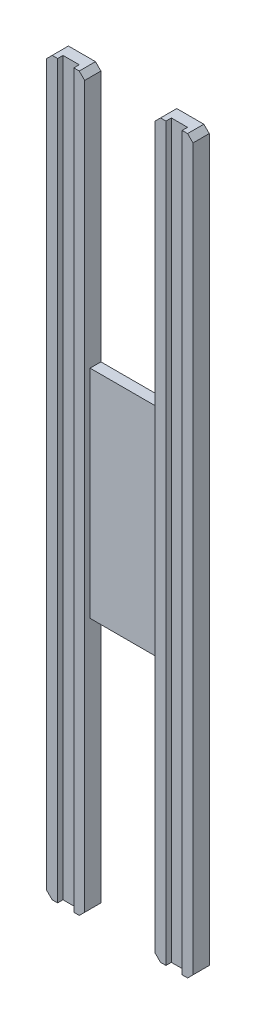
ISO-10303-21;
HEADER;
FILE_DESCRIPTION(('STEP AP214'),'2;1');
FILE_NAME('part.step','',(''),(''),'','','');
FILE_SCHEMA(('AUTOMOTIVE_DESIGN { 1 0 10303 214 1 1 1 1 }'));
ENDSEC;
DATA;
#1=APPLICATION_CONTEXT('core data for automotive mechanical design processes');
#2=APPLICATION_PROTOCOL_DEFINITION('international standard','automotive_design',2000,#1);
#3=PRODUCT_CONTEXT('',#1,'mechanical');
#4=PRODUCT('Part','Part','',(#3));
#5=PRODUCT_RELATED_PRODUCT_CATEGORY('part','',(#4));
#6=PRODUCT_DEFINITION_FORMATION('','',#4);
#7=PRODUCT_DEFINITION_CONTEXT('part definition',#1,'design');
#8=PRODUCT_DEFINITION('design','',#6,#7);
#9=PRODUCT_DEFINITION_SHAPE('','',#8);
#10=(LENGTH_UNIT() NAMED_UNIT(*) SI_UNIT(.MILLI.,.METRE.));
#11=(NAMED_UNIT(*) PLANE_ANGLE_UNIT() SI_UNIT($,.RADIAN.));
#12=(NAMED_UNIT(*) SI_UNIT($,.STERADIAN.) SOLID_ANGLE_UNIT());
#13=UNCERTAINTY_MEASURE_WITH_UNIT(LENGTH_MEASURE(1.E-05),#10,'distance_accuracy_value','');
#14=(GEOMETRIC_REPRESENTATION_CONTEXT(3) GLOBAL_UNCERTAINTY_ASSIGNED_CONTEXT((#13)) GLOBAL_UNIT_ASSIGNED_CONTEXT((#10,
#11,#12)) REPRESENTATION_CONTEXT('',''));
#15=CARTESIAN_POINT('',(0.,0.,0.));
#16=DIRECTION('',(0.,0.,1.));
#17=DIRECTION('',(1.,0.,0.));
#18=AXIS2_PLACEMENT_3D('',#15,#16,#17);
#19=CARTESIAN_POINT('',(-13.5,-47.5,2.99999999999998));
#20=DIRECTION('',(0.,-1.,0.));
#21=DIRECTION('',(1.,0.,0.));
#22=AXIS2_PLACEMENT_3D('',#19,#20,#21);
#23=PLANE('',#22);
#24=DIRECTION('',(1.,0.,0.));
#25=VECTOR('',#24,1.);
#26=CARTESIAN_POINT('',(-13.5,-47.5,2.99999999999998));
#27=LINE('',#26,#25);
#28=CARTESIAN_POINT('',(-8.49999999999999,-47.5,2.99999999999998));
#29=VERTEX_POINT('',#28);
#30=CARTESIAN_POINT('',(-7.50000000000002,-47.5,2.99999999999998));
#31=VERTEX_POINT('',#30);
#32=EDGE_CURVE('E254',#29,#31,#27,.T.);
#33=ORIENTED_EDGE('',*,*,#32,.F.);
#34=DIRECTION('',(0.,0.,-1.));
#35=VECTOR('',#34,1.);
#36=CARTESIAN_POINT('',(-8.49999999999999,-47.5,2.99999999999998));
#37=LINE('',#36,#35);
#38=CARTESIAN_POINT('',(-8.49999999999999,-47.5,1.99999999999998));
#39=VERTEX_POINT('',#38);
#40=EDGE_CURVE('E237',#29,#39,#37,.T.);
#41=ORIENTED_EDGE('',*,*,#40,.T.);
#42=DIRECTION('',(-1.,0.,0.));
#43=VECTOR('',#42,1.);
#44=CARTESIAN_POINT('',(-8.49999999999999,-47.5,1.99999999999998));
#45=LINE('',#44,#43);
#46=CARTESIAN_POINT('',(-11.5,-47.5,1.99999999999998));
#47=VERTEX_POINT('',#46);
#48=EDGE_CURVE('E564',#39,#47,#45,.T.);
#49=ORIENTED_EDGE('',*,*,#48,.T.);
#50=DIRECTION('',(0.,0.,1.));
#51=VECTOR('',#50,1.);
#52=CARTESIAN_POINT('',(-11.5,-47.5,1.99999999999998));
#53=LINE('',#52,#51);
#54=CARTESIAN_POINT('',(-11.5,-47.5,2.99999999999998));
#55=VERTEX_POINT('',#54);
#56=EDGE_CURVE('E568',#47,#55,#53,.T.);
#57=ORIENTED_EDGE('',*,*,#56,.T.);
#58=CARTESIAN_POINT('',(-12.5,-47.5,2.99999999999998));
#59=VERTEX_POINT('',#58);
#60=EDGE_CURVE('E245',#59,#55,#27,.T.);
#61=ORIENTED_EDGE('',*,*,#60,.F.);
#62=DIRECTION('',(0.,0.,-1.));
#63=VECTOR('',#62,1.);
#64=CARTESIAN_POINT('',(-12.5,-47.5,2.99999999999998));
#65=LINE('',#64,#63);
#66=CARTESIAN_POINT('',(-12.5,-47.5,0.));
#67=VERTEX_POINT('',#66);
#68=EDGE_CURVE('E447',#59,#67,#65,.T.);
#69=ORIENTED_EDGE('',*,*,#68,.T.);
#70=DIRECTION('',(1.,0.,0.));
#71=VECTOR('',#70,1.);
#72=CARTESIAN_POINT('',(-13.5,-47.5,0.));
#73=LINE('',#72,#71);
#74=CARTESIAN_POINT('',(-7.50000000000002,-47.5,0.));
#75=VERTEX_POINT('',#74);
#76=EDGE_CURVE('E265',#67,#75,#73,.T.);
#77=ORIENTED_EDGE('',*,*,#76,.T.);
#78=DIRECTION('',(0.,0.,1.));
#79=VECTOR('',#78,1.);
#80=CARTESIAN_POINT('',(-7.50000000000002,-47.5,2.99999999999998));
#81=LINE('',#80,#79);
#82=EDGE_CURVE('E451',#75,#31,#81,.T.);
#83=ORIENTED_EDGE('',*,*,#82,.T.);
#84=EDGE_LOOP('',(#33,#41,#49,#57,#61,#69,#77,#83));
#85=FACE_BOUND('',#84,.T.);
#86=ADVANCED_FACE('F41',(#85),#23,.T.);
#87=CARTESIAN_POINT('',(-13.5000000000001,87.5,3.));
#88=DIRECTION('',(0.,0.,1.));
#89=DIRECTION('',(0.,-1.,0.));
#90=AXIS2_PLACEMENT_3D('',#87,#88,#89);
#91=PLANE('',#90);
#92=DIRECTION('',(1.,0.,0.));
#93=VECTOR('',#92,1.);
#94=CARTESIAN_POINT('',(-13.5000000000001,87.5,3.));
#95=LINE('',#94,#93);
#96=CARTESIAN_POINT('',(-8.50000000000009,87.5,2.99999999999982));
#97=VERTEX_POINT('',#96);
#98=CARTESIAN_POINT('',(-7.50000000000012,87.5,3.));
#99=VERTEX_POINT('',#98);
#100=EDGE_CURVE('E255',#97,#99,#95,.T.);
#101=ORIENTED_EDGE('',*,*,#100,.F.);
#102=DIRECTION('',(0.,-1.,0.));
#103=VECTOR('',#102,1.);
#104=CARTESIAN_POINT('',(-8.50000000000009,87.5,2.99999999999982));
#105=LINE('',#104,#103);
#106=EDGE_CURVE('E545',#97,#29,#105,.T.);
#107=ORIENTED_EDGE('',*,*,#106,.T.);
#108=ORIENTED_EDGE('',*,*,#32,.T.);
#109=DIRECTION('',(0.707106781186543,0.707106781186552,0.));
#110=VECTOR('',#109,1.);
#111=CARTESIAN_POINT('',(57.,17.0000000000009,2.99999999999999));
#112=LINE('',#111,#110);
#113=CARTESIAN_POINT('',(-6.49999999999999,-46.5,2.99999999999998));
#114=VERTEX_POINT('',#113);
#115=EDGE_CURVE('E465',#31,#114,#112,.T.);
#116=ORIENTED_EDGE('',*,*,#115,.T.);
#117=DIRECTION('',(0.,-1.,0.));
#118=VECTOR('',#117,1.);
#119=CARTESIAN_POINT('',(-6.50000000000009,87.5,3.));
#120=LINE('',#119,#118);
#121=CARTESIAN_POINT('',(-6.50000000000009,86.4999999999999,3.));
#122=VERTEX_POINT('',#121);
#123=EDGE_CURVE('E537',#122,#114,#120,.T.);
#124=ORIENTED_EDGE('',*,*,#123,.F.);
#125=DIRECTION('',(-0.707106781186542,0.707106781186553,0.));
#126=VECTOR('',#125,1.);
#127=CARTESIAN_POINT('',(-10.5000000000001,90.5,3.));
#128=LINE('',#127,#126);
#129=EDGE_CURVE('E458',#122,#99,#128,.T.);
#130=ORIENTED_EDGE('',*,*,#129,.T.);
#131=EDGE_LOOP('',(#101,#107,#108,#116,#124,#130));
#132=FACE_BOUND('',#131,.T.);
#133=ADVANCED_FACE('F582',(#132),#91,.T.);
#134=ORIENTED_EDGE('',*,*,#60,.T.);
#135=DIRECTION('',(0.,-1.,0.));
#136=VECTOR('',#135,1.);
#137=CARTESIAN_POINT('',(-11.5000000000001,87.5,2.99999999999982));
#138=LINE('',#137,#136);
#139=CARTESIAN_POINT('',(-11.5000000000001,87.5,2.99999999999982));
#140=VERTEX_POINT('',#139);
#141=EDGE_CURVE('E230',#140,#55,#138,.T.);
#142=ORIENTED_EDGE('',*,*,#141,.F.);
#143=CARTESIAN_POINT('',(-12.5000000000001,87.5,3.));
#144=VERTEX_POINT('',#143);
#145=EDGE_CURVE('E243',#144,#140,#95,.T.);
#146=ORIENTED_EDGE('',*,*,#145,.F.);
#147=DIRECTION('',(0.707106781186543,0.707106781186552,0.));
#148=VECTOR('',#147,1.);
#149=CARTESIAN_POINT('',(-13.0000000000001,87.,3.));
#150=LINE('',#149,#148);
#151=CARTESIAN_POINT('',(-13.5000000000001,86.5,3.));
#152=VERTEX_POINT('',#151);
#153=EDGE_CURVE('E455',#144,#152,#150,.F.);
#154=ORIENTED_EDGE('',*,*,#153,.T.);
#155=DIRECTION('',(0.,-1.,0.));
#156=VECTOR('',#155,1.);
#157=CARTESIAN_POINT('',(-13.5000000000001,87.5,3.));
#158=LINE('',#157,#156);
#159=CARTESIAN_POINT('',(-13.5,-46.5000000000001,2.99999999999998));
#160=VERTEX_POINT('',#159);
#161=EDGE_CURVE('E547',#152,#160,#158,.T.);
#162=ORIENTED_EDGE('',*,*,#161,.T.);
#163=DIRECTION('',(-0.707106781186548,0.707106781186548,0.));
#164=VECTOR('',#163,1.);
#165=CARTESIAN_POINT('',(-80.5,20.5,2.99999999999999));
#166=LINE('',#165,#164);
#167=EDGE_CURVE('E462',#160,#59,#166,.F.);
#168=ORIENTED_EDGE('',*,*,#167,.T.);
#169=EDGE_LOOP('',(#134,#142,#146,#154,#162,#168));
#170=FACE_BOUND('',#169,.T.);
#171=ADVANCED_FACE('F242',(#170),#91,.T.);
#172=CARTESIAN_POINT('',(-13.5000000000001,87.5,0.));
#173=DIRECTION('',(0.,1.,0.));
#174=DIRECTION('',(-1.,0.,0.));
#175=AXIS2_PLACEMENT_3D('',#172,#173,#174);
#176=PLANE('',#175);
#177=DIRECTION('',(-1.,0.,0.));
#178=VECTOR('',#177,1.);
#179=CARTESIAN_POINT('',(-8.50000000000009,87.5,1.99999999999982));
#180=LINE('',#179,#178);
#181=CARTESIAN_POINT('',(-8.50000000000009,87.5,1.99999999999982));
#182=VERTEX_POINT('',#181);
#183=CARTESIAN_POINT('',(-11.5000000000001,87.5,1.99999999999982));
#184=VERTEX_POINT('',#183);
#185=EDGE_CURVE('E236',#182,#184,#180,.T.);
#186=ORIENTED_EDGE('',*,*,#185,.F.);
#187=DIRECTION('',(0.,0.,-1.));
#188=VECTOR('',#187,1.);
#189=CARTESIAN_POINT('',(-8.50000000000009,87.5,2.99999999999982));
#190=LINE('',#189,#188);
#191=EDGE_CURVE('E247',#97,#182,#190,.T.);
#192=ORIENTED_EDGE('',*,*,#191,.F.);
#193=ORIENTED_EDGE('',*,*,#100,.T.);
#194=DIRECTION('',(0.,0.,-1.));
#195=VECTOR('',#194,1.);
#196=CARTESIAN_POINT('',(-7.50000000000012,87.5,0.));
#197=LINE('',#196,#195);
#198=CARTESIAN_POINT('',(-7.50000000000012,87.5,0.));
#199=VERTEX_POINT('',#198);
#200=EDGE_CURVE('E11',#99,#199,#197,.T.);
#201=ORIENTED_EDGE('',*,*,#200,.T.);
#202=DIRECTION('',(1.,0.,0.));
#203=VECTOR('',#202,1.);
#204=CARTESIAN_POINT('',(-13.5000000000001,87.5,0.));
#205=LINE('',#204,#203);
#206=CARTESIAN_POINT('',(-12.5000000000001,87.5,0.));
#207=VERTEX_POINT('',#206);
#208=EDGE_CURVE('E260',#207,#199,#205,.T.);
#209=ORIENTED_EDGE('',*,*,#208,.F.);
#210=DIRECTION('',(0.,0.,1.));
#211=VECTOR('',#210,1.);
#212=CARTESIAN_POINT('',(-12.5000000000001,87.5,0.));
#213=LINE('',#212,#211);
#214=EDGE_CURVE('E51',#207,#144,#213,.T.);
#215=ORIENTED_EDGE('',*,*,#214,.T.);
#216=ORIENTED_EDGE('',*,*,#145,.T.);
#217=DIRECTION('',(0.,0.,1.));
#218=VECTOR('',#217,1.);
#219=CARTESIAN_POINT('',(-11.5000000000001,87.5,1.99999999999982));
#220=LINE('',#219,#218);
#221=EDGE_CURVE('E227',#184,#140,#220,.T.);
#222=ORIENTED_EDGE('',*,*,#221,.F.);
#223=EDGE_LOOP('',(#186,#192,#193,#201,#209,#215,#216,#222));
#224=FACE_BOUND('',#223,.T.);
#225=ADVANCED_FACE('F250',(#224),#176,.T.);
#226=CARTESIAN_POINT('',(13.5,87.5,3.));
#227=DIRECTION('',(0.,0.,-1.));
#228=DIRECTION('',(0.,1.,0.));
#229=AXIS2_PLACEMENT_3D('',#226,#227,#228);
#230=PLANE('',#229);
#231=DIRECTION('',(-1.,0.,0.));
#232=VECTOR('',#231,1.);
#233=CARTESIAN_POINT('',(13.5,87.5,3.));
#234=LINE('',#233,#232);
#235=CARTESIAN_POINT('',(12.4999999999999,87.5,3.));
#236=VERTEX_POINT('',#235);
#237=CARTESIAN_POINT('',(11.5,87.5,2.99999999999982));
#238=VERTEX_POINT('',#237);
#239=EDGE_CURVE('E343',#236,#238,#234,.T.);
#240=ORIENTED_EDGE('',*,*,#239,.T.);
#241=DIRECTION('',(0.,-1.,0.));
#242=VECTOR('',#241,1.);
#243=CARTESIAN_POINT('',(11.5,87.5,2.99999999999982));
#244=LINE('',#243,#242);
#245=CARTESIAN_POINT('',(11.5000000000001,-47.5,2.99999999999998));
#246=VERTEX_POINT('',#245);
#247=EDGE_CURVE('E305',#238,#246,#244,.T.);
#248=ORIENTED_EDGE('',*,*,#247,.T.);
#249=DIRECTION('',(-1.,0.,0.));
#250=VECTOR('',#249,1.);
#251=CARTESIAN_POINT('',(13.5000000000001,-47.5,2.99999999999998));
#252=LINE('',#251,#250);
#253=CARTESIAN_POINT('',(12.5000000000001,-47.5,2.99999999999998));
#254=VERTEX_POINT('',#253);
#255=EDGE_CURVE('E338',#254,#246,#252,.T.);
#256=ORIENTED_EDGE('',*,*,#255,.F.);
#257=DIRECTION('',(0.707106781186543,0.707106781186552,0.));
#258=VECTOR('',#257,1.);
#259=CARTESIAN_POINT('',(13.5000000000001,-46.5,2.99999999999998));
#260=LINE('',#259,#258);
#261=CARTESIAN_POINT('',(13.5000000000001,-46.5,2.99999999999998));
#262=VERTEX_POINT('',#261);
#263=EDGE_CURVE('E405',#254,#262,#260,.T.);
#264=ORIENTED_EDGE('',*,*,#263,.T.);
#265=DIRECTION('',(0.,-1.,0.));
#266=VECTOR('',#265,1.);
#267=CARTESIAN_POINT('',(13.5,87.5,3.));
#268=LINE('',#267,#266);
#269=CARTESIAN_POINT('',(13.5,86.5,3.));
#270=VERTEX_POINT('',#269);
#271=EDGE_CURVE('E322',#270,#262,#268,.T.);
#272=ORIENTED_EDGE('',*,*,#271,.F.);
#273=DIRECTION('',(-0.707106781186543,0.707106781186552,0.));
#274=VECTOR('',#273,1.);
#275=CARTESIAN_POINT('',(13.5,86.5,3.));
#276=LINE('',#275,#274);
#277=EDGE_CURVE('E399',#270,#236,#276,.T.);
#278=ORIENTED_EDGE('',*,*,#277,.T.);
#279=EDGE_LOOP('',(#240,#248,#256,#264,#272,#278));
#280=FACE_BOUND('',#279,.T.);
#281=ADVANCED_FACE('F507',(#280),#230,.F.);
#282=CARTESIAN_POINT('',(6.50000000000002,0.,2.));
#283=DIRECTION('',(0.,1.,0.));
#284=DIRECTION('',(-1.,0.,0.));
#285=AXIS2_PLACEMENT_3D('',#282,#283,#284);
#286=PLANE('',#285);
#287=DIRECTION('',(1.,0.,0.));
#288=VECTOR('',#287,1.);
#289=CARTESIAN_POINT('',(6.50000000000002,0.,0.));
#290=LINE('',#289,#288);
#291=CARTESIAN_POINT('',(-6.50000000000002,0.,0.));
#292=VERTEX_POINT('',#291);
#293=CARTESIAN_POINT('',(6.50000000000002,0.,0.));
#294=VERTEX_POINT('',#293);
#295=EDGE_CURVE('E351',#292,#294,#290,.T.);
#296=ORIENTED_EDGE('',*,*,#295,.T.);
#297=DIRECTION('',(0.,0.,-1.));
#298=VECTOR('',#297,1.);
#299=CARTESIAN_POINT('',(6.50000000000002,0.,2.));
#300=LINE('',#299,#298);
#301=CARTESIAN_POINT('',(6.50000000000002,0.,2.));
#302=VERTEX_POINT('',#301);
#303=EDGE_CURVE('E370',#302,#294,#300,.T.);
#304=ORIENTED_EDGE('',*,*,#303,.F.);
#305=DIRECTION('',(1.,0.,0.));
#306=VECTOR('',#305,1.);
#307=CARTESIAN_POINT('',(6.50000000000002,0.,2.));
#308=LINE('',#307,#306);
#309=CARTESIAN_POINT('',(-6.50000000000002,0.,2.));
#310=VERTEX_POINT('',#309);
#311=EDGE_CURVE('E352',#310,#302,#308,.T.);
#312=ORIENTED_EDGE('',*,*,#311,.F.);
#313=DIRECTION('',(0.,0.,-1.));
#314=VECTOR('',#313,1.);
#315=CARTESIAN_POINT('',(-6.50000000000002,0.,2.));
#316=LINE('',#315,#314);
#317=EDGE_CURVE('E273',#310,#292,#316,.T.);
#318=ORIENTED_EDGE('',*,*,#317,.T.);
#319=EDGE_LOOP('',(#296,#304,#312,#318));
#320=FACE_BOUND('',#319,.T.);
#321=ADVANCED_FACE('F530',(#320),#286,.F.);
#322=CARTESIAN_POINT('',(0.,40.,2.));
#323=DIRECTION('',(0.,-1.,0.));
#324=DIRECTION('',(0.,0.,-1.));
#325=AXIS2_PLACEMENT_3D('',#322,#323,#324);
#326=PLANE('',#325);
#327=DIRECTION('',(-1.,0.,0.));
#328=VECTOR('',#327,1.);
#329=CARTESIAN_POINT('',(0.,40.,0.));
#330=LINE('',#329,#328);
#331=CARTESIAN_POINT('',(6.49999999999999,40.,0.));
#332=VERTEX_POINT('',#331);
#333=CARTESIAN_POINT('',(-6.50000000000005,40.,0.));
#334=VERTEX_POINT('',#333);
#335=EDGE_CURVE('E356',#332,#334,#330,.T.);
#336=ORIENTED_EDGE('',*,*,#335,.T.);
#337=DIRECTION('',(0.,0.,-1.));
#338=VECTOR('',#337,1.);
#339=CARTESIAN_POINT('',(-6.50000000000006,40.,2.));
#340=LINE('',#339,#338);
#341=CARTESIAN_POINT('',(-6.50000000000006,40.,2.));
#342=VERTEX_POINT('',#341);
#343=EDGE_CURVE('E277',#342,#334,#340,.T.);
#344=ORIENTED_EDGE('',*,*,#343,.F.);
#345=DIRECTION('',(-1.,0.,0.));
#346=VECTOR('',#345,1.);
#347=CARTESIAN_POINT('',(0.,40.,2.));
#348=LINE('',#347,#346);
#349=CARTESIAN_POINT('',(6.49999999999999,40.,2.));
#350=VERTEX_POINT('',#349);
#351=EDGE_CURVE('E359',#350,#342,#348,.T.);
#352=ORIENTED_EDGE('',*,*,#351,.F.);
#353=DIRECTION('',(0.,0.,-1.));
#354=VECTOR('',#353,1.);
#355=CARTESIAN_POINT('',(6.49999999999999,40.,2.));
#356=LINE('',#355,#354);
#357=EDGE_CURVE('E362',#350,#332,#356,.T.);
#358=ORIENTED_EDGE('',*,*,#357,.T.);
#359=EDGE_LOOP('',(#336,#344,#352,#358));
#360=FACE_BOUND('',#359,.T.);
#361=ADVANCED_FACE('F644',(#360),#326,.F.);
#362=CARTESIAN_POINT('',(0.,0.,2.));
#363=DIRECTION('',(0.,0.,-1.));
#364=DIRECTION('',(-1.,0.,0.));
#365=AXIS2_PLACEMENT_3D('',#362,#363,#364);
#366=PLANE('',#365);
#367=ORIENTED_EDGE('',*,*,#311,.T.);
#368=DIRECTION('',(0.,1.,0.));
#369=VECTOR('',#368,1.);
#370=CARTESIAN_POINT('',(6.49999999999999,40.,2.));
#371=LINE('',#370,#369);
#372=EDGE_CURVE('E355',#302,#350,#371,.T.);
#373=ORIENTED_EDGE('',*,*,#372,.T.);
#374=ORIENTED_EDGE('',*,*,#351,.T.);
#375=DIRECTION('',(0.,1.,0.));
#376=VECTOR('',#375,1.);
#377=CARTESIAN_POINT('',(-6.50000000000006,40.,2.));
#378=LINE('',#377,#376);
#379=EDGE_CURVE('E269',#310,#342,#378,.T.);
#380=ORIENTED_EDGE('',*,*,#379,.F.);
#381=EDGE_LOOP('',(#367,#373,#374,#380));
#382=FACE_BOUND('',#381,.T.);
#383=ADVANCED_FACE('F641',(#382),#366,.F.);
#384=CARTESIAN_POINT('',(0.,0.,0.));
#385=DIRECTION('',(0.,0.,-1.));
#386=DIRECTION('',(-1.,0.,0.));
#387=AXIS2_PLACEMENT_3D('',#384,#385,#386);
#388=PLANE('',#387);
#389=DIRECTION('',(0.,1.,0.));
#390=VECTOR('',#389,1.);
#391=CARTESIAN_POINT('',(-6.49999999999999,-47.5,0.));
#392=LINE('',#391,#390);
#393=CARTESIAN_POINT('',(-6.49999999999999,-46.5,0.));
#394=VERTEX_POINT('',#393);
#395=EDGE_CURVE('E533',#394,#292,#392,.T.);
#396=ORIENTED_EDGE('',*,*,#395,.F.);
#397=DIRECTION('',(-0.707106781186543,-0.707106781186552,0.));
#398=VECTOR('',#397,1.);
#399=CARTESIAN_POINT('',(19.9999999999999,-19.9999999999997,0.));
#400=LINE('',#399,#398);
#401=EDGE_CURVE('E444',#394,#75,#400,.T.);
#402=ORIENTED_EDGE('',*,*,#401,.T.);
#403=ORIENTED_EDGE('',*,*,#76,.F.);
#404=DIRECTION('',(0.707106781186548,-0.707106781186548,0.));
#405=VECTOR('',#404,1.);
#406=CARTESIAN_POINT('',(-30.,-30.,0.));
#407=LINE('',#406,#405);
#408=CARTESIAN_POINT('',(-13.5,-46.5,0.));
#409=VERTEX_POINT('',#408);
#410=EDGE_CURVE('E441',#67,#409,#407,.F.);
#411=ORIENTED_EDGE('',*,*,#410,.T.);
#412=DIRECTION('',(0.,1.,0.));
#413=VECTOR('',#412,1.);
#414=CARTESIAN_POINT('',(-13.5,-47.5,0.));
#415=LINE('',#414,#413);
#416=CARTESIAN_POINT('',(-13.5000000000001,86.5,0.));
#417=VERTEX_POINT('',#416);
#418=EDGE_CURVE('E543',#409,#417,#415,.T.);
#419=ORIENTED_EDGE('',*,*,#418,.T.);
#420=DIRECTION('',(-0.707106781186543,-0.707106781186552,0.));
#421=VECTOR('',#420,1.);
#422=CARTESIAN_POINT('',(-50.0000000000001,49.9999999999994,0.));
#423=LINE('',#422,#421);
#424=EDGE_CURVE('E435',#417,#207,#423,.F.);
#425=ORIENTED_EDGE('',*,*,#424,.T.);
#426=ORIENTED_EDGE('',*,*,#208,.T.);
#427=DIRECTION('',(0.707106781186542,-0.707106781186553,0.));
#428=VECTOR('',#427,1.);
#429=CARTESIAN_POINT('',(39.9999999999999,39.9999999999993,0.));
#430=LINE('',#429,#428);
#431=CARTESIAN_POINT('',(-6.50000000000009,86.4999999999999,0.));
#432=VERTEX_POINT('',#431);
#433=EDGE_CURVE('E438',#199,#432,#430,.T.);
#434=ORIENTED_EDGE('',*,*,#433,.T.);
#435=EDGE_CURVE('E538',#334,#432,#392,.T.);
#436=ORIENTED_EDGE('',*,*,#435,.F.);
#437=ORIENTED_EDGE('',*,*,#335,.F.);
#438=DIRECTION('',(0.,1.,0.));
#439=VECTOR('',#438,1.);
#440=CARTESIAN_POINT('',(6.50000000000006,-47.5,0.));
#441=LINE('',#440,#439);
#442=CARTESIAN_POINT('',(6.49999999999996,86.5,0.));
#443=VERTEX_POINT('',#442);
#444=EDGE_CURVE('E309',#332,#443,#441,.T.);
#445=ORIENTED_EDGE('',*,*,#444,.T.);
#446=DIRECTION('',(-0.707106781186548,-0.707106781186548,0.));
#447=VECTOR('',#446,1.);
#448=CARTESIAN_POINT('',(-40.,40.,0.));
#449=LINE('',#448,#447);
#450=CARTESIAN_POINT('',(7.49999999999995,87.5,0.));
#451=VERTEX_POINT('',#450);
#452=EDGE_CURVE('E384',#443,#451,#449,.F.);
#453=ORIENTED_EDGE('',*,*,#452,.T.);
#454=DIRECTION('',(-1.,0.,0.));
#455=VECTOR('',#454,1.);
#456=CARTESIAN_POINT('',(13.5,87.5,0.));
#457=LINE('',#456,#455);
#458=CARTESIAN_POINT('',(12.4999999999999,87.5,0.));
#459=VERTEX_POINT('',#458);
#460=EDGE_CURVE('E347',#459,#451,#457,.T.);
#461=ORIENTED_EDGE('',*,*,#460,.F.);
#462=DIRECTION('',(0.707106781186543,-0.707106781186552,0.));
#463=VECTOR('',#462,1.);
#464=CARTESIAN_POINT('',(50.,49.9999999999994,0.));
#465=LINE('',#464,#463);
#466=CARTESIAN_POINT('',(13.5,86.5,0.));
#467=VERTEX_POINT('',#466);
#468=EDGE_CURVE('E381',#459,#467,#465,.T.);
#469=ORIENTED_EDGE('',*,*,#468,.T.);
#470=DIRECTION('',(0.,1.,0.));
#471=VECTOR('',#470,1.);
#472=CARTESIAN_POINT('',(13.5000000000001,-47.5,0.));
#473=LINE('',#472,#471);
#474=CARTESIAN_POINT('',(13.5000000000001,-46.5,0.));
#475=VERTEX_POINT('',#474);
#476=EDGE_CURVE('E318',#475,#467,#473,.T.);
#477=ORIENTED_EDGE('',*,*,#476,.F.);
#478=DIRECTION('',(-0.707106781186543,-0.707106781186552,0.));
#479=VECTOR('',#478,1.);
#480=CARTESIAN_POINT('',(30.0000000000001,-29.9999999999997,0.));
#481=LINE('',#480,#479);
#482=CARTESIAN_POINT('',(12.5000000000001,-47.5,0.));
#483=VERTEX_POINT('',#482);
#484=EDGE_CURVE('E387',#475,#483,#481,.T.);
#485=ORIENTED_EDGE('',*,*,#484,.T.);
#486=DIRECTION('',(-1.,0.,0.));
#487=VECTOR('',#486,1.);
#488=CARTESIAN_POINT('',(13.5000000000001,-47.5,0.));
#489=LINE('',#488,#487);
#490=CARTESIAN_POINT('',(7.50000000000007,-47.5,0.));
#491=VERTEX_POINT('',#490);
#492=EDGE_CURVE('E327',#483,#491,#489,.T.);
#493=ORIENTED_EDGE('',*,*,#492,.T.);
#494=DIRECTION('',(0.707106781186548,-0.707106781186548,0.));
#495=VECTOR('',#494,1.);
#496=CARTESIAN_POINT('',(-20.,-20.,0.));
#497=LINE('',#496,#495);
#498=CARTESIAN_POINT('',(6.50000000000006,-46.5,0.));
#499=VERTEX_POINT('',#498);
#500=EDGE_CURVE('E390',#491,#499,#497,.F.);
#501=ORIENTED_EDGE('',*,*,#500,.T.);
#502=EDGE_CURVE('E328',#499,#294,#441,.T.);
#503=ORIENTED_EDGE('',*,*,#502,.T.);
#504=ORIENTED_EDGE('',*,*,#295,.F.);
#505=EDGE_LOOP('',(#396,#402,#403,#411,#419,#425,#426,#434,#436,#437,#445,#453,#461,#469,#477,
#485,#493,#501,#503,#504));
#506=FACE_BOUND('',#505,.T.);
#507=ADVANCED_FACE('F482',(#506),#388,.T.);
#508=CARTESIAN_POINT('',(13.5,87.5,0.));
#509=DIRECTION('',(0.,-1.,0.));
#510=DIRECTION('',(1.,0.,0.));
#511=AXIS2_PLACEMENT_3D('',#508,#509,#510);
#512=PLANE('',#511);
#513=DIRECTION('',(1.,0.,0.));
#514=VECTOR('',#513,1.);
#515=CARTESIAN_POINT('',(8.49999999999996,87.5,1.99999999999982));
#516=LINE('',#515,#514);
#517=CARTESIAN_POINT('',(8.49999999999996,87.5,1.99999999999982));
#518=VERTEX_POINT('',#517);
#519=CARTESIAN_POINT('',(11.5,87.5,1.99999999999982));
#520=VERTEX_POINT('',#519);
#521=EDGE_CURVE('E286',#518,#520,#516,.T.);
#522=ORIENTED_EDGE('',*,*,#521,.T.);
#523=DIRECTION('',(0.,0.,1.));
#524=VECTOR('',#523,1.);
#525=CARTESIAN_POINT('',(11.5,87.5,1.99999999999982));
#526=LINE('',#525,#524);
#527=EDGE_CURVE('E291',#520,#238,#526,.T.);
#528=ORIENTED_EDGE('',*,*,#527,.T.);
#529=ORIENTED_EDGE('',*,*,#239,.F.);
#530=DIRECTION('',(0.,0.,-1.));
#531=VECTOR('',#530,1.);
#532=CARTESIAN_POINT('',(12.4999999999999,87.5,0.));
#533=LINE('',#532,#531);
#534=EDGE_CURVE('E420',#236,#459,#533,.T.);
#535=ORIENTED_EDGE('',*,*,#534,.T.);
#536=ORIENTED_EDGE('',*,*,#460,.T.);
#537=DIRECTION('',(0.,0.,1.));
#538=VECTOR('',#537,1.);
#539=CARTESIAN_POINT('',(7.49999999999995,87.5,0.));
#540=LINE('',#539,#538);
#541=CARTESIAN_POINT('',(7.49999999999995,87.5,3.));
#542=VERTEX_POINT('',#541);
#543=EDGE_CURVE('E423',#451,#542,#540,.T.);
#544=ORIENTED_EDGE('',*,*,#543,.T.);
#545=CARTESIAN_POINT('',(8.49999999999996,87.5,2.99999999999982));
#546=VERTEX_POINT('',#545);
#547=EDGE_CURVE('E342',#546,#542,#234,.T.);
#548=ORIENTED_EDGE('',*,*,#547,.F.);
#549=DIRECTION('',(0.,0.,-1.));
#550=VECTOR('',#549,1.);
#551=CARTESIAN_POINT('',(8.49999999999996,87.5,2.99999999999982));
#552=LINE('',#551,#550);
#553=EDGE_CURVE('E282',#546,#518,#552,.T.);
#554=ORIENTED_EDGE('',*,*,#553,.T.);
#555=EDGE_LOOP('',(#522,#528,#529,#535,#536,#544,#548,#554));
#556=FACE_BOUND('',#555,.T.);
#557=ADVANCED_FACE('F494',(#556),#512,.F.);
#558=CARTESIAN_POINT('',(8.50000000000006,-47.5,2.99999999999998));
#559=VERTEX_POINT('',#558);
#560=CARTESIAN_POINT('',(7.50000000000007,-47.5,2.99999999999998));
#561=VERTEX_POINT('',#560);
#562=EDGE_CURVE('E337',#559,#561,#252,.T.);
#563=ORIENTED_EDGE('',*,*,#562,.F.);
#564=DIRECTION('',(0.,-1.,0.));
#565=VECTOR('',#564,1.);
#566=CARTESIAN_POINT('',(8.49999999999996,87.5,2.99999999999982));
#567=LINE('',#566,#565);
#568=EDGE_CURVE('E295',#546,#559,#567,.T.);
#569=ORIENTED_EDGE('',*,*,#568,.F.);
#570=ORIENTED_EDGE('',*,*,#547,.T.);
#571=DIRECTION('',(0.707106781186548,0.707106781186548,0.));
#572=VECTOR('',#571,1.);
#573=CARTESIAN_POINT('',(7.49999999999996,87.5,3.));
#574=LINE('',#573,#572);
#575=CARTESIAN_POINT('',(6.49999999999996,86.5,3.));
#576=VERTEX_POINT('',#575);
#577=EDGE_CURVE('E402',#542,#576,#574,.F.);
#578=ORIENTED_EDGE('',*,*,#577,.T.);
#579=DIRECTION('',(0.,-1.,0.));
#580=VECTOR('',#579,1.);
#581=CARTESIAN_POINT('',(6.49999999999996,87.5,3.));
#582=LINE('',#581,#580);
#583=CARTESIAN_POINT('',(6.50000000000006,-46.5,2.99999999999998));
#584=VERTEX_POINT('',#583);
#585=EDGE_CURVE('E323',#576,#584,#582,.T.);
#586=ORIENTED_EDGE('',*,*,#585,.T.);
#587=DIRECTION('',(-0.707106781186548,0.707106781186548,0.));
#588=VECTOR('',#587,1.);
#589=CARTESIAN_POINT('',(7.50000000000008,-47.5,2.99999999999998));
#590=LINE('',#589,#588);
#591=EDGE_CURVE('E408',#584,#561,#590,.F.);
#592=ORIENTED_EDGE('',*,*,#591,.T.);
#593=EDGE_LOOP('',(#563,#569,#570,#578,#586,#592));
#594=FACE_BOUND('',#593,.T.);
#595=ADVANCED_FACE('F635',(#594),#230,.F.);
#596=CARTESIAN_POINT('',(13.5000000000001,-47.5,2.99999999999998));
#597=DIRECTION('',(0.,1.,0.));
#598=DIRECTION('',(-1.,0.,0.));
#599=AXIS2_PLACEMENT_3D('',#596,#597,#598);
#600=PLANE('',#599);
#601=ORIENTED_EDGE('',*,*,#255,.T.);
#602=DIRECTION('',(0.,0.,1.));
#603=VECTOR('',#602,1.);
#604=CARTESIAN_POINT('',(11.5000000000001,-47.5,1.99999999999998));
#605=LINE('',#604,#603);
#606=CARTESIAN_POINT('',(11.5000000000001,-47.5,1.99999999999998));
#607=VERTEX_POINT('',#606);
#608=EDGE_CURVE('E287',#607,#246,#605,.T.);
#609=ORIENTED_EDGE('',*,*,#608,.F.);
#610=DIRECTION('',(1.,0.,0.));
#611=VECTOR('',#610,1.);
#612=CARTESIAN_POINT('',(8.50000000000006,-47.5,1.99999999999998));
#613=LINE('',#612,#611);
#614=CARTESIAN_POINT('',(8.50000000000006,-47.5,1.99999999999998));
#615=VERTEX_POINT('',#614);
#616=EDGE_CURVE('E299',#615,#607,#613,.T.);
#617=ORIENTED_EDGE('',*,*,#616,.F.);
#618=DIRECTION('',(0.,0.,-1.));
#619=VECTOR('',#618,1.);
#620=CARTESIAN_POINT('',(8.50000000000006,-47.5,2.99999999999998));
#621=LINE('',#620,#619);
#622=EDGE_CURVE('E281',#559,#615,#621,.T.);
#623=ORIENTED_EDGE('',*,*,#622,.F.);
#624=ORIENTED_EDGE('',*,*,#562,.T.);
#625=DIRECTION('',(0.,0.,-1.));
#626=VECTOR('',#625,1.);
#627=CARTESIAN_POINT('',(7.50000000000007,-47.5,2.99999999999998));
#628=LINE('',#627,#626);
#629=EDGE_CURVE('E377',#561,#491,#628,.T.);
#630=ORIENTED_EDGE('',*,*,#629,.T.);
#631=ORIENTED_EDGE('',*,*,#492,.F.);
#632=DIRECTION('',(0.,0.,1.));
#633=VECTOR('',#632,1.);
#634=CARTESIAN_POINT('',(12.5000000000001,-47.5,2.99999999999998));
#635=LINE('',#634,#633);
#636=EDGE_CURVE('E374',#483,#254,#635,.T.);
#637=ORIENTED_EDGE('',*,*,#636,.T.);
#638=EDGE_LOOP('',(#601,#609,#617,#623,#624,#630,#631,#637));
#639=FACE_BOUND('',#638,.T.);
#640=ADVANCED_FACE('F515',(#639),#600,.F.);
#641=CARTESIAN_POINT('',(13.5,0.,0.));
#642=DIRECTION('',(1.,0.,0.));
#643=DIRECTION('',(0.,1.,0.));
#644=AXIS2_PLACEMENT_3D('',#641,#642,#643);
#645=PLANE('',#644);
#646=ORIENTED_EDGE('',*,*,#271,.T.);
#647=DIRECTION('',(0.,0.,-1.));
#648=VECTOR('',#647,1.);
#649=CARTESIAN_POINT('',(13.5000000000001,-46.5,0.));
#650=LINE('',#649,#648);
#651=EDGE_CURVE('E416',#262,#475,#650,.T.);
#652=ORIENTED_EDGE('',*,*,#651,.T.);
#653=ORIENTED_EDGE('',*,*,#476,.T.);
#654=DIRECTION('',(0.,0.,1.));
#655=VECTOR('',#654,1.);
#656=CARTESIAN_POINT('',(13.5,86.5,3.));
#657=LINE('',#656,#655);
#658=EDGE_CURVE('E412',#467,#270,#657,.T.);
#659=ORIENTED_EDGE('',*,*,#658,.T.);
#660=EDGE_LOOP('',(#646,#652,#653,#659));
#661=FACE_BOUND('',#660,.T.);
#662=ADVANCED_FACE('F504',(#661),#645,.T.);
#663=CARTESIAN_POINT('',(6.50000000000002,0.,0.));
#664=DIRECTION('',(1.,0.,0.));
#665=DIRECTION('',(0.,1.,0.));
#666=AXIS2_PLACEMENT_3D('',#663,#664,#665);
#667=PLANE('',#666);
#668=ORIENTED_EDGE('',*,*,#502,.F.);
#669=DIRECTION('',(0.,0.,1.));
#670=VECTOR('',#669,1.);
#671=CARTESIAN_POINT('',(6.50000000000006,-46.5,0.));
#672=LINE('',#671,#670);
#673=EDGE_CURVE('E396',#499,#584,#672,.T.);
#674=ORIENTED_EDGE('',*,*,#673,.T.);
#675=ORIENTED_EDGE('',*,*,#585,.F.);
#676=DIRECTION('',(0.,0.,-1.));
#677=VECTOR('',#676,1.);
#678=CARTESIAN_POINT('',(6.49999999999996,86.5,0.));
#679=LINE('',#678,#677);
#680=EDGE_CURVE('E393',#576,#443,#679,.T.);
#681=ORIENTED_EDGE('',*,*,#680,.T.);
#682=ORIENTED_EDGE('',*,*,#444,.F.);
#683=ORIENTED_EDGE('',*,*,#357,.F.);
#684=ORIENTED_EDGE('',*,*,#372,.F.);
#685=ORIENTED_EDGE('',*,*,#303,.T.);
#686=EDGE_LOOP('',(#668,#674,#675,#681,#682,#683,#684,#685));
#687=FACE_BOUND('',#686,.T.);
#688=ADVANCED_FACE('F525',(#687),#667,.F.);
#689=CARTESIAN_POINT('',(7.50000000000008,-47.5,2.99999999999998));
#690=DIRECTION('',(0.707106781186547,0.707106781186547,0.));
#691=DIRECTION('',(0.,0.,-1.));
#692=AXIS2_PLACEMENT_3D('',#689,#690,#691);
#693=PLANE('',#692);
#694=ORIENTED_EDGE('',*,*,#591,.F.);
#695=ORIENTED_EDGE('',*,*,#673,.F.);
#696=ORIENTED_EDGE('',*,*,#500,.F.);
#697=ORIENTED_EDGE('',*,*,#629,.F.);
#698=EDGE_LOOP('',(#694,#695,#696,#697));
#699=FACE_BOUND('',#698,.T.);
#700=ADVANCED_FACE('F521',(#699),#693,.F.);
#701=CARTESIAN_POINT('',(13.5000000000001,-46.5,0.));
#702=DIRECTION('',(0.707106781186552,-0.707106781186543,0.));
#703=DIRECTION('',(0.,0.,1.));
#704=AXIS2_PLACEMENT_3D('',#701,#702,#703);
#705=PLANE('',#704);
#706=ORIENTED_EDGE('',*,*,#263,.F.);
#707=ORIENTED_EDGE('',*,*,#636,.F.);
#708=ORIENTED_EDGE('',*,*,#484,.F.);
#709=ORIENTED_EDGE('',*,*,#651,.F.);
#710=EDGE_LOOP('',(#706,#707,#708,#709));
#711=FACE_BOUND('',#710,.T.);
#712=ADVANCED_FACE('F512',(#711),#705,.T.);
#713=CARTESIAN_POINT('',(7.49999999999996,87.5,0.));
#714=DIRECTION('',(0.707106781186547,-0.707106781186547,0.));
#715=DIRECTION('',(0.,0.,1.));
#716=AXIS2_PLACEMENT_3D('',#713,#714,#715);
#717=PLANE('',#716);
#718=ORIENTED_EDGE('',*,*,#452,.F.);
#719=ORIENTED_EDGE('',*,*,#680,.F.);
#720=ORIENTED_EDGE('',*,*,#577,.F.);
#721=ORIENTED_EDGE('',*,*,#543,.F.);
#722=EDGE_LOOP('',(#718,#719,#720,#721));
#723=FACE_BOUND('',#722,.T.);
#724=ADVANCED_FACE('F490',(#723),#717,.F.);
#725=CARTESIAN_POINT('',(13.5,86.5,0.));
#726=DIRECTION('',(0.707106781186552,0.707106781186543,0.));
#727=DIRECTION('',(0.,0.,-1.));
#728=AXIS2_PLACEMENT_3D('',#725,#726,#727);
#729=PLANE('',#728);
#730=ORIENTED_EDGE('',*,*,#468,.F.);
#731=ORIENTED_EDGE('',*,*,#534,.F.);
#732=ORIENTED_EDGE('',*,*,#277,.F.);
#733=ORIENTED_EDGE('',*,*,#658,.F.);
#734=EDGE_LOOP('',(#730,#731,#732,#733));
#735=FACE_BOUND('',#734,.T.);
#736=ADVANCED_FACE('F501',(#735),#729,.T.);
#737=CARTESIAN_POINT('',(11.5,87.5,1.99999999999982));
#738=DIRECTION('',(1.,0.,0.));
#739=DIRECTION('',(0.,1.,0.));
#740=AXIS2_PLACEMENT_3D('',#737,#738,#739);
#741=PLANE('',#740);
#742=ORIENTED_EDGE('',*,*,#608,.T.);
#743=ORIENTED_EDGE('',*,*,#247,.F.);
#744=ORIENTED_EDGE('',*,*,#527,.F.);
#745=DIRECTION('',(0.,-1.,0.));
#746=VECTOR('',#745,1.);
#747=CARTESIAN_POINT('',(11.5,87.5,1.99999999999982));
#748=LINE('',#747,#746);
#749=EDGE_CURVE('E310',#520,#607,#748,.T.);
#750=ORIENTED_EDGE('',*,*,#749,.T.);
#751=EDGE_LOOP('',(#742,#743,#744,#750));
#752=FACE_BOUND('',#751,.T.);
#753=ADVANCED_FACE('F617',(#752),#741,.F.);
#754=CARTESIAN_POINT('',(8.49999999999996,87.5,1.99999999999982));
#755=DIRECTION('',(0.,0.,-1.));
#756=DIRECTION('',(0.,1.,0.));
#757=AXIS2_PLACEMENT_3D('',#754,#755,#756);
#758=PLANE('',#757);
#759=ORIENTED_EDGE('',*,*,#616,.T.);
#760=ORIENTED_EDGE('',*,*,#749,.F.);
#761=ORIENTED_EDGE('',*,*,#521,.F.);
#762=DIRECTION('',(0.,-1.,0.));
#763=VECTOR('',#762,1.);
#764=CARTESIAN_POINT('',(8.49999999999996,87.5,1.99999999999982));
#765=LINE('',#764,#763);
#766=EDGE_CURVE('E313',#518,#615,#765,.T.);
#767=ORIENTED_EDGE('',*,*,#766,.T.);
#768=EDGE_LOOP('',(#759,#760,#761,#767));
#769=FACE_BOUND('',#768,.T.);
#770=ADVANCED_FACE('F620',(#769),#758,.F.);
#771=CARTESIAN_POINT('',(8.49999999999996,87.5,2.99999999999982));
#772=DIRECTION('',(-1.,0.,0.));
#773=DIRECTION('',(0.,-1.,0.));
#774=AXIS2_PLACEMENT_3D('',#771,#772,#773);
#775=PLANE('',#774);
#776=ORIENTED_EDGE('',*,*,#622,.T.);
#777=ORIENTED_EDGE('',*,*,#766,.F.);
#778=ORIENTED_EDGE('',*,*,#553,.F.);
#779=ORIENTED_EDGE('',*,*,#568,.T.);
#780=EDGE_LOOP('',(#776,#777,#778,#779));
#781=FACE_BOUND('',#780,.T.);
#782=ADVANCED_FACE('F624',(#781),#775,.F.);
#783=CARTESIAN_POINT('',(-13.5,0.,0.));
#784=DIRECTION('',(-1.,0.,0.));
#785=DIRECTION('',(0.,1.,0.));
#786=AXIS2_PLACEMENT_3D('',#783,#784,#785);
#787=PLANE('',#786);
#788=ORIENTED_EDGE('',*,*,#418,.F.);
#789=DIRECTION('',(0.,0.,1.));
#790=VECTOR('',#789,1.);
#791=CARTESIAN_POINT('',(-13.5,-46.5,0.));
#792=LINE('',#791,#790);
#793=EDGE_CURVE('E66',#409,#160,#792,.T.);
#794=ORIENTED_EDGE('',*,*,#793,.T.);
#795=ORIENTED_EDGE('',*,*,#161,.F.);
#796=DIRECTION('',(0.,0.,-1.));
#797=VECTOR('',#796,1.);
#798=CARTESIAN_POINT('',(-13.5000000000001,86.5,0.));
#799=LINE('',#798,#797);
#800=EDGE_CURVE('E468',#152,#417,#799,.T.);
#801=ORIENTED_EDGE('',*,*,#800,.T.);
#802=EDGE_LOOP('',(#788,#794,#795,#801));
#803=FACE_BOUND('',#802,.T.);
#804=ADVANCED_FACE('F596',(#803),#787,.T.);
#805=CARTESIAN_POINT('',(-6.50000000000002,0.,0.));
#806=DIRECTION('',(-1.,0.,0.));
#807=DIRECTION('',(0.,1.,0.));
#808=AXIS2_PLACEMENT_3D('',#805,#806,#807);
#809=PLANE('',#808);
#810=ORIENTED_EDGE('',*,*,#123,.T.);
#811=DIRECTION('',(0.,0.,-1.));
#812=VECTOR('',#811,1.);
#813=CARTESIAN_POINT('',(-6.49999999999999,-46.5,0.));
#814=LINE('',#813,#812);
#815=EDGE_CURVE('E431',#114,#394,#814,.T.);
#816=ORIENTED_EDGE('',*,*,#815,.T.);
#817=ORIENTED_EDGE('',*,*,#395,.T.);
#818=ORIENTED_EDGE('',*,*,#317,.F.);
#819=ORIENTED_EDGE('',*,*,#379,.T.);
#820=ORIENTED_EDGE('',*,*,#343,.T.);
#821=ORIENTED_EDGE('',*,*,#435,.T.);
#822=DIRECTION('',(0.,0.,1.));
#823=VECTOR('',#822,1.);
#824=CARTESIAN_POINT('',(-6.50000000000009,86.4999999999999,3.));
#825=LINE('',#824,#823);
#826=EDGE_CURVE('E427',#432,#122,#825,.T.);
#827=ORIENTED_EDGE('',*,*,#826,.T.);
#828=EDGE_LOOP('',(#810,#816,#817,#818,#819,#820,#821,#827));
#829=FACE_BOUND('',#828,.T.);
#830=ADVANCED_FACE('F680',(#829),#809,.F.);
#831=CARTESIAN_POINT('',(-6.49999999999999,-46.5,0.));
#832=DIRECTION('',(0.707106781186552,-0.707106781186543,0.));
#833=DIRECTION('',(0.,0.,1.));
#834=AXIS2_PLACEMENT_3D('',#831,#832,#833);
#835=PLANE('',#834);
#836=ORIENTED_EDGE('',*,*,#115,.F.);
#837=ORIENTED_EDGE('',*,*,#82,.F.);
#838=ORIENTED_EDGE('',*,*,#401,.F.);
#839=ORIENTED_EDGE('',*,*,#815,.F.);
#840=EDGE_LOOP('',(#836,#837,#838,#839));
#841=FACE_BOUND('',#840,.T.);
#842=ADVANCED_FACE('F674',(#841),#835,.T.);
#843=CARTESIAN_POINT('',(-12.5,-47.5,2.99999999999998));
#844=DIRECTION('',(0.707106781186548,0.707106781186548,0.));
#845=DIRECTION('',(0.,0.,-1.));
#846=AXIS2_PLACEMENT_3D('',#843,#844,#845);
#847=PLANE('',#846);
#848=ORIENTED_EDGE('',*,*,#167,.F.);
#849=ORIENTED_EDGE('',*,*,#793,.F.);
#850=ORIENTED_EDGE('',*,*,#410,.F.);
#851=ORIENTED_EDGE('',*,*,#68,.F.);
#852=EDGE_LOOP('',(#848,#849,#850,#851));
#853=FACE_BOUND('',#852,.T.);
#854=ADVANCED_FACE('F598',(#853),#847,.F.);
#855=CARTESIAN_POINT('',(-6.50000000000009,86.4999999999999,0.));
#856=DIRECTION('',(0.707106781186553,0.707106781186542,0.));
#857=DIRECTION('',(0.,0.,-1.));
#858=AXIS2_PLACEMENT_3D('',#855,#856,#857);
#859=PLANE('',#858);
#860=ORIENTED_EDGE('',*,*,#433,.F.);
#861=ORIENTED_EDGE('',*,*,#200,.F.);
#862=ORIENTED_EDGE('',*,*,#129,.F.);
#863=ORIENTED_EDGE('',*,*,#826,.F.);
#864=EDGE_LOOP('',(#860,#861,#862,#863));
#865=FACE_BOUND('',#864,.T.);
#866=ADVANCED_FACE('F589',(#865),#859,.T.);
#867=CARTESIAN_POINT('',(-12.5000000000001,87.5,0.));
#868=DIRECTION('',(0.707106781186552,-0.707106781186543,0.));
#869=DIRECTION('',(0.,0.,1.));
#870=AXIS2_PLACEMENT_3D('',#867,#868,#869);
#871=PLANE('',#870);
#872=ORIENTED_EDGE('',*,*,#424,.F.);
#873=ORIENTED_EDGE('',*,*,#800,.F.);
#874=ORIENTED_EDGE('',*,*,#153,.F.);
#875=ORIENTED_EDGE('',*,*,#214,.F.);
#876=EDGE_LOOP('',(#872,#873,#874,#875));
#877=FACE_BOUND('',#876,.T.);
#878=ADVANCED_FACE('F44',(#877),#871,.F.);
#879=CARTESIAN_POINT('',(-8.50000000000009,87.5,2.99999999999982));
#880=DIRECTION('',(-1.,0.,0.));
#881=DIRECTION('',(0.,-1.,0.));
#882=AXIS2_PLACEMENT_3D('',#879,#880,#881);
#883=PLANE('',#882);
#884=ORIENTED_EDGE('',*,*,#40,.F.);
#885=ORIENTED_EDGE('',*,*,#106,.F.);
#886=ORIENTED_EDGE('',*,*,#191,.T.);
#887=DIRECTION('',(0.,-1.,0.));
#888=VECTOR('',#887,1.);
#889=CARTESIAN_POINT('',(-8.50000000000009,87.5,1.99999999999982));
#890=LINE('',#889,#888);
#891=EDGE_CURVE('E555',#182,#39,#890,.T.);
#892=ORIENTED_EDGE('',*,*,#891,.T.);
#893=EDGE_LOOP('',(#884,#885,#886,#892));
#894=FACE_BOUND('',#893,.T.);
#895=ADVANCED_FACE('F601',(#894),#883,.T.);
#896=CARTESIAN_POINT('',(-8.50000000000009,87.5,1.99999999999982));
#897=DIRECTION('',(0.,0.,1.));
#898=DIRECTION('',(0.,-1.,0.));
#899=AXIS2_PLACEMENT_3D('',#896,#897,#898);
#900=PLANE('',#899);
#901=ORIENTED_EDGE('',*,*,#48,.F.);
#902=ORIENTED_EDGE('',*,*,#891,.F.);
#903=ORIENTED_EDGE('',*,*,#185,.T.);
#904=DIRECTION('',(0.,-1.,0.));
#905=VECTOR('',#904,1.);
#906=CARTESIAN_POINT('',(-11.5000000000001,87.5,1.99999999999982));
#907=LINE('',#906,#905);
#908=EDGE_CURVE('E58',#184,#47,#907,.T.);
#909=ORIENTED_EDGE('',*,*,#908,.T.);
#910=EDGE_LOOP('',(#901,#902,#903,#909));
#911=FACE_BOUND('',#910,.T.);
#912=ADVANCED_FACE('F577',(#911),#900,.T.);
#913=CARTESIAN_POINT('',(-11.5000000000001,87.5,1.99999999999982));
#914=DIRECTION('',(1.,0.,0.));
#915=DIRECTION('',(0.,1.,0.));
#916=AXIS2_PLACEMENT_3D('',#913,#914,#915);
#917=PLANE('',#916);
#918=ORIENTED_EDGE('',*,*,#56,.F.);
#919=ORIENTED_EDGE('',*,*,#908,.F.);
#920=ORIENTED_EDGE('',*,*,#221,.T.);
#921=ORIENTED_EDGE('',*,*,#141,.T.);
#922=EDGE_LOOP('',(#918,#919,#920,#921));
#923=FACE_BOUND('',#922,.T.);
#924=ADVANCED_FACE('F229',(#923),#917,.T.);
#925=CLOSED_SHELL('',(#86,#133,#171,#225,#281,#321,#361,#383,#507,#557,#595,#640,#662,#688,#700,
#712,#724,#736,#753,#770,#782,#804,#830,#842,#854,#866,#878,#895,#912,#924));
#926=MANIFOLD_SOLID_BREP('B2',#925);
#927=ADVANCED_BREP_SHAPE_REPRESENTATION('',(#18,#926),#14);
#928=SHAPE_DEFINITION_REPRESENTATION(#9,#927);
ENDSEC;
END-ISO-10303-21;
